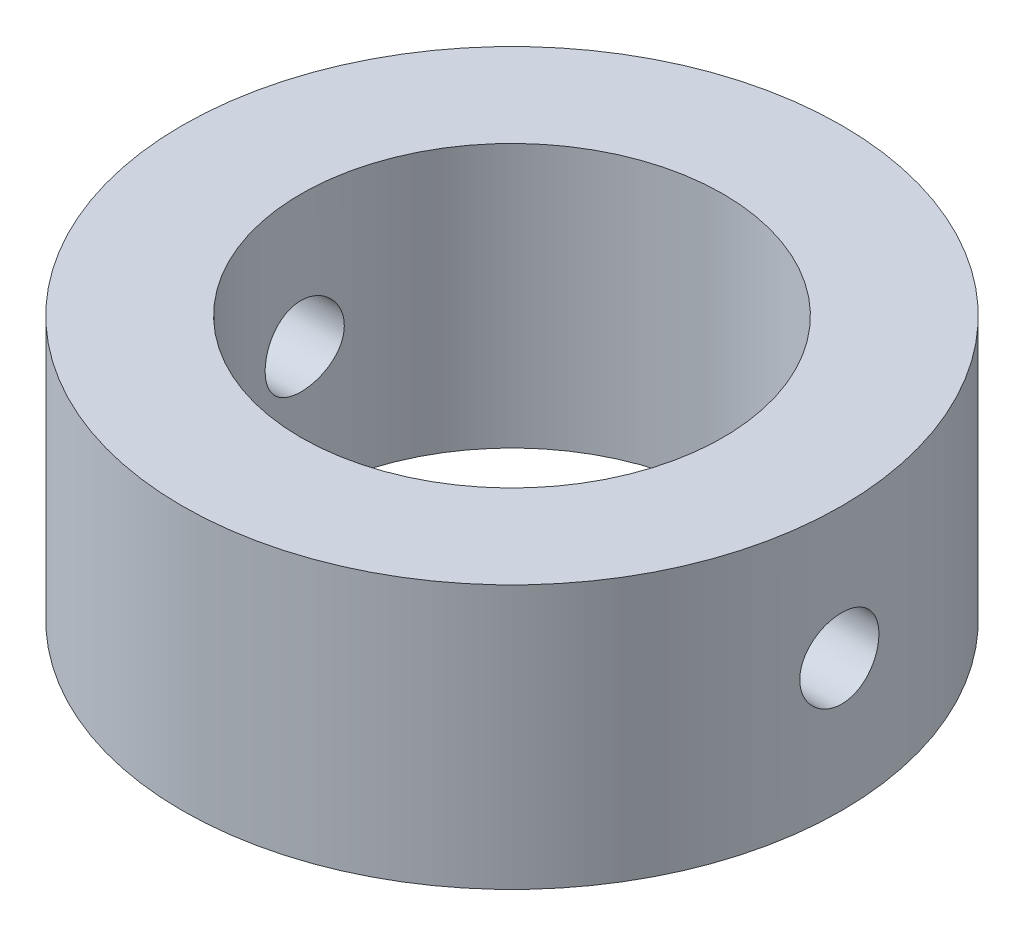
ISO-10303-21;
HEADER;
FILE_DESCRIPTION(('STEP AP214'),'2;1');
FILE_NAME('part.step','',(''),(''),'','','');
FILE_SCHEMA(('AUTOMOTIVE_DESIGN { 1 0 10303 214 1 1 1 1 }'));
ENDSEC;
DATA;
#1=APPLICATION_CONTEXT('core data for automotive mechanical design processes');
#2=APPLICATION_PROTOCOL_DEFINITION('international standard','automotive_design',2000,#1);
#3=PRODUCT_CONTEXT('',#1,'mechanical');
#4=PRODUCT('Part','Part','',(#3));
#5=PRODUCT_RELATED_PRODUCT_CATEGORY('part','',(#4));
#6=PRODUCT_DEFINITION_FORMATION('','',#4);
#7=PRODUCT_DEFINITION_CONTEXT('part definition',#1,'design');
#8=PRODUCT_DEFINITION('design','',#6,#7);
#9=PRODUCT_DEFINITION_SHAPE('','',#8);
#10=(LENGTH_UNIT() NAMED_UNIT(*) SI_UNIT(.MILLI.,.METRE.));
#11=(NAMED_UNIT(*) PLANE_ANGLE_UNIT() SI_UNIT($,.RADIAN.));
#12=(NAMED_UNIT(*) SI_UNIT($,.STERADIAN.) SOLID_ANGLE_UNIT());
#13=UNCERTAINTY_MEASURE_WITH_UNIT(LENGTH_MEASURE(1.E-05),#10,'distance_accuracy_value','');
#14=(GEOMETRIC_REPRESENTATION_CONTEXT(3) GLOBAL_UNCERTAINTY_ASSIGNED_CONTEXT((#13)) GLOBAL_UNIT_ASSIGNED_CONTEXT((#10,
#11,#12)) REPRESENTATION_CONTEXT('',''));
#15=CARTESIAN_POINT('',(0.,0.,0.));
#16=DIRECTION('',(0.,0.,1.));
#17=DIRECTION('',(1.,0.,0.));
#18=AXIS2_PLACEMENT_3D('',#15,#16,#17);
#19=CARTESIAN_POINT('',(6.59950128580252E-06,7.50000100534023,-6.87768785484062E-07));
#20=DIRECTION('',(0.,1.,0.));
#21=DIRECTION('',(0.,0.,1.));
#22=AXIS2_PLACEMENT_3D('',#19,#20,#21);
#23=PLANE('',#22);
#24=CARTESIAN_POINT('',(6.59950128580252E-06,7.50000100534023,-6.87768785484062E-07));
#25=DIRECTION('',(0.,1.,0.));
#26=DIRECTION('',(0.,0.,1.));
#27=AXIS2_PLACEMENT_3D('',#24,#25,#26);
#28=CIRCLE('',#27,6.25);
#29=CARTESIAN_POINT('',(6.59950128580252E-06,7.50000100534023,6.24999931223121));
#30=VERTEX_POINT('',#29);
#31=EDGE_CURVE('E10',#30,#30,#28,.T.);
#32=ORIENTED_EDGE('',*,*,#31,.T.);
#33=EDGE_LOOP('',(#32));
#34=FACE_BOUND('',#33,.T.);
#35=CARTESIAN_POINT('',(6.59950128580252E-06,7.50000100534023,-6.87768785484062E-07));
#36=DIRECTION('',(0.,1.,0.));
#37=DIRECTION('',(0.,0.,1.));
#38=AXIS2_PLACEMENT_3D('',#35,#36,#37);
#39=CIRCLE('',#38,4.);
#40=CARTESIAN_POINT('',(6.59950128580252E-06,7.50000100534023,3.99999931223121));
#41=VERTEX_POINT('',#40);
#42=EDGE_CURVE('E57',#41,#41,#39,.T.);
#43=ORIENTED_EDGE('',*,*,#42,.F.);
#44=EDGE_LOOP('',(#43));
#45=FACE_BOUND('',#44,.T.);
#46=ADVANCED_FACE('F36',(#34,#45),#23,.T.);
#47=CARTESIAN_POINT('',(6.59950128580252E-06,2.50000100534023,-6.87768785484062E-07));
#48=DIRECTION('',(0.,1.,0.));
#49=DIRECTION('',(0.,0.,1.));
#50=AXIS2_PLACEMENT_3D('',#47,#48,#49);
#51=PLANE('',#50);
#52=CARTESIAN_POINT('',(6.59950128580252E-06,2.50000100534023,-6.87768785484062E-07));
#53=DIRECTION('',(0.,1.,0.));
#54=DIRECTION('',(0.,0.,1.));
#55=AXIS2_PLACEMENT_3D('',#52,#53,#54);
#56=CIRCLE('',#55,6.25);
#57=CARTESIAN_POINT('',(6.59950128580252E-06,2.50000100534023,6.24999931223121));
#58=VERTEX_POINT('',#57);
#59=EDGE_CURVE('E51',#58,#58,#56,.T.);
#60=ORIENTED_EDGE('',*,*,#59,.F.);
#61=EDGE_LOOP('',(#60));
#62=FACE_BOUND('',#61,.T.);
#63=CARTESIAN_POINT('',(6.59950128580252E-06,2.50000100534023,-6.87768785484062E-07));
#64=DIRECTION('',(0.,1.,0.));
#65=DIRECTION('',(0.,0.,1.));
#66=AXIS2_PLACEMENT_3D('',#63,#64,#65);
#67=CIRCLE('',#66,4.);
#68=CARTESIAN_POINT('',(6.59950128580252E-06,2.50000100534023,3.99999931223121));
#69=VERTEX_POINT('',#68);
#70=EDGE_CURVE('E60',#69,#69,#67,.T.);
#71=ORIENTED_EDGE('',*,*,#70,.T.);
#72=EDGE_LOOP('',(#71));
#73=FACE_BOUND('',#72,.T.);
#74=ADVANCED_FACE('F101',(#62,#73),#51,.F.);
#75=CARTESIAN_POINT('',(6.59950128580252E-06,7.50000100534023,-6.87768785484062E-07));
#76=DIRECTION('',(0.,-1.,0.));
#77=DIRECTION('',(0.,0.,-1.));
#78=AXIS2_PLACEMENT_3D('',#75,#76,#77);
#79=CYLINDRICAL_SURFACE('',#78,6.25);
#80=CARTESIAN_POINT('',(6.25000659950128,4.25000100534023,-6.87768785484062E-07));
#81=CARTESIAN_POINT('',(6.25000603343776,4.25000279632559,0.0419653240081394));
#82=CARTESIAN_POINT('',(6.24957945451149,4.2535351700134,0.0839578915640124));
#83=CARTESIAN_POINT('',(6.24791877585678,4.26757127137908,0.166775455058277));
#84=CARTESIAN_POINT('',(6.24668382284448,4.27808236565288,0.207599169628732));
#85=CARTESIAN_POINT('',(6.24354558113694,4.30576257447173,0.286868011066347));
#86=CARTESIAN_POINT('',(6.241642732384,4.32292730704627,0.325314684129276));
#87=CARTESIAN_POINT('',(6.23738058110991,4.36341818911105,0.398774101689215));
#88=CARTESIAN_POINT('',(6.23502135960481,4.38674324527856,0.433787454015004));
#89=CARTESIAN_POINT('',(6.23009662586177,4.43901972083404,0.499572141067342));
#90=CARTESIAN_POINT('',(6.22753022527389,4.46799621536821,0.530323485058015));
#91=CARTESIAN_POINT('',(6.22248758443008,4.5306992465622,0.586539139827069));
#92=CARTESIAN_POINT('',(6.22001134867798,4.56442602009489,0.612003186797398));
#93=CARTESIAN_POINT('',(6.2154206087614,4.63580121166483,0.656995169415955));
#94=CARTESIAN_POINT('',(6.21330724710056,4.67346143648526,0.676504501412639));
#95=CARTESIAN_POINT('',(6.20969313311843,4.75155318086742,0.708914455485114));
#96=CARTESIAN_POINT('',(6.20819235934623,4.79198460333256,0.721815308973155));
#97=CARTESIAN_POINT('',(6.20598175134472,4.87426422016809,0.740581637344713));
#98=CARTESIAN_POINT('',(6.20526813581485,4.91610463744715,0.74648075720033));
#99=CARTESIAN_POINT('',(6.20470104176657,5.00018723943127,0.751180250280389));
#100=CARTESIAN_POINT('',(6.2048475312771,5.04242940914447,0.749980887363334));
#101=CARTESIAN_POINT('',(6.20598063615894,5.12588249653632,0.740545102427885));
#102=CARTESIAN_POINT('',(6.20696283536817,5.16709766501027,0.732345670286971));
#103=CARTESIAN_POINT('',(6.20964980169147,5.24756276229557,0.709200177656382));
#104=CARTESIAN_POINT('',(6.21135458239347,5.28681265413498,0.694253990295751));
#105=CARTESIAN_POINT('',(6.21529965148819,5.36234837240001,0.657999263980869));
#106=CARTESIAN_POINT('',(6.21754129605623,5.39862637492862,0.636674577741027));
#107=CARTESIAN_POINT('',(6.2223064491988,5.46710280806917,0.588279745154888));
#108=CARTESIAN_POINT('',(6.2248299696566,5.49930106656587,0.561209356539106));
#109=CARTESIAN_POINT('',(6.22989418221721,5.55891877643132,0.501886201136664));
#110=CARTESIAN_POINT('',(6.23243488135728,5.58630649780449,0.469601537359254));
#111=CARTESIAN_POINT('',(6.23723211946501,5.63527888559031,0.400876301965895));
#112=CARTESIAN_POINT('',(6.2394886578618,5.65686354034502,0.364435722001226));
#113=CARTESIAN_POINT('',(6.24346457104383,5.69361682675014,0.288409139296926));
#114=CARTESIAN_POINT('',(6.24518378632152,5.70878355367284,0.248822206910112));
#115=CARTESIAN_POINT('',(6.24788986582854,5.73224568980296,0.167638317799574));
#116=CARTESIAN_POINT('',(6.24887676164089,5.74054139534135,0.12604144784162));
#117=CARTESIAN_POINT('',(6.25000291200888,5.74998506921465,0.0422929113247686));
#118=CARTESIAN_POINT('',(6.2501473518451,5.7511767634404,0.000146242339227246));
#119=CARTESIAN_POINT('',(6.24958629508206,5.74649386087316,-0.0837462048296007));
#120=CARTESIAN_POINT('',(6.24888081513397,5.74061940251639,-0.125491990850618));
#121=CARTESIAN_POINT('',(6.24670243401844,5.72200726433946,-0.207269253750875));
#122=CARTESIAN_POINT('',(6.245231855449,5.70929035207771,-0.247305524361044));
#123=CARTESIAN_POINT('',(6.2416879870461,5.67737582950183,-0.3246770371904));
#124=CARTESIAN_POINT('',(6.23961467822025,5.65817801496771,-0.362012194249654));
#125=CARTESIAN_POINT('',(6.23508372846865,5.61374027636462,-0.433117482185047));
#126=CARTESIAN_POINT('',(6.23262430161736,5.58847197088753,-0.466869760175663));
#127=CARTESIAN_POINT('',(6.22760204748677,5.53265079373819,-0.529669750649294));
#128=CARTESIAN_POINT('',(6.22503921643839,5.50209772930324,-0.558717291451159));
#129=CARTESIAN_POINT('',(6.22008308662484,5.43638210148331,-0.61143767583417));
#130=CARTESIAN_POINT('',(6.21769074528397,5.40119625150427,-0.635081595848633));
#131=CARTESIAN_POINT('',(6.21336197433587,5.32732724907134,-0.676123973842115));
#132=CARTESIAN_POINT('',(6.21142553619985,5.28864416206067,-0.69352254865897));
#133=CARTESIAN_POINT('',(6.20823424286384,5.20897335311656,-0.721533179439182));
#134=CARTESIAN_POINT('',(6.20697773139211,5.16799150237538,-0.73216173816715));
#135=CARTESIAN_POINT('',(6.20528373136596,5.08480876296896,-0.746383868177577));
#136=CARTESIAN_POINT('',(6.20484620792894,5.0426079263009,-0.749977739083989));
#137=CARTESIAN_POINT('',(6.20484068115302,4.95847282293094,-0.750023272313612));
#138=CARTESIAN_POINT('',(6.20526714609987,4.91653857389741,-0.746520371947162));
#139=CARTESIAN_POINT('',(6.20692967318692,4.83385930874169,-0.732567809449008));
#140=CARTESIAN_POINT('',(6.2081657356177,4.79311429304633,-0.722118144823953));
#141=CARTESIAN_POINT('',(6.21130651261594,4.71397487061806,-0.694582537320149));
#142=CARTESIAN_POINT('',(6.21321102492159,4.67557975696636,-0.677498601695133));
#143=CARTESIAN_POINT('',(6.21747446297975,4.6021940685727,-0.637183894338809));
#144=CARTESIAN_POINT('',(6.21983339265511,4.5672035232254,-0.613953069542399));
#145=CARTESIAN_POINT('',(6.22475797756597,4.50138777031302,-0.561834911886798));
#146=CARTESIAN_POINT('',(6.22732481403496,4.47058947952366,-0.532913697594161));
#147=CARTESIAN_POINT('',(6.23236547370551,4.41426538544873,-0.470305921104903));
#148=CARTESIAN_POINT('',(6.23483927476403,4.38874083093293,-0.436618233427788));
#149=CARTESIAN_POINT('',(6.23942464223439,4.34361336084052,-0.365298993931628));
#150=CARTESIAN_POINT('',(6.24153490490653,4.32403157390966,-0.32765399642483));
#151=CARTESIAN_POINT('',(6.24514206249445,4.29149506422959,-0.249606375690114));
#152=CARTESIAN_POINT('',(6.24663962901666,4.27853308129513,-0.209206828859322));
#153=CARTESIAN_POINT('',(6.24848830765126,4.2627351502557,-0.140494963077959));
#154=CARTESIAN_POINT('',(6.24905491935952,4.25796663436864,-0.112617330207157));
#155=CARTESIAN_POINT('',(6.24981425460638,4.25159896946749,-0.0564973716922087));
#156=CARTESIAN_POINT('',(6.25000698061358,4.24999979952762,-0.0282550484571916));
#157=CARTESIAN_POINT('',(6.25000659950128,4.25000100534023,-6.87768785484062E-07));
#158=B_SPLINE_CURVE_WITH_KNOTS('',3,(#80,#81,#82,#83,#84,#85,#86,#87,#88,#89,#90,#91,#92,#93,
#94,#95,#96,#97,#98,#99,#100,#101,#102,#103,#104,#105,#106,#107,#108,#109,#110,#111,#112,#113,
#114,#115,#116,#117,#118,#119,#120,#121,#122,#123,#124,#125,#126,#127,#128,#129,#130,#131,#132,
#133,#134,#135,#136,#137,#138,#139,#140,#141,#142,#143,#144,#145,#146,#147,#148,#149,#150,#151,
#152,#153,#154,#155,#156,#157),.UNSPECIFIED.,.T.,.F.,(4,2,2,2,2,2,2,2,2,2,2,2,2,2,2,2,2,2,2,2,2,
2,2,2,2,2,2,2,2,2,2,2,2,2,2,2,2,2,4),(0.,0.12579483773904,0.251722673521558,0.3775677159389,
0.503390438604232,0.629784680489694,0.756185227262208,0.882976723740993,1.00976377999778,
1.1359390958582,1.2621097216712,1.38761773228063,1.51312810313349,1.63895893427634,
1.76479507217315,1.89143236160079,2.0180699054315,2.1447450067357,2.27141464455655,
2.39730380656057,2.5231905022527,2.64869725639437,2.77420796575417,2.90031730446391,
3.02643124400891,3.15320518954179,3.27997676326575,3.40643812066222,3.53289409165386,
3.65854298298073,3.78419191940584,3.90980286928471,4.03541490357804,4.1617988100508,
4.28821260880023,4.41507072559865,4.54178941198187,4.62648357364067,4.71117717609952),.UNSPECIFIED.);
#159=CARTESIAN_POINT('',(6.25000659950128,4.25000100534023,-6.87768785484062E-07));
#160=VERTEX_POINT('',#159);
#161=EDGE_CURVE('E87',#160,#160,#158,.T.);
#162=ORIENTED_EDGE('',*,*,#161,.T.);
#163=EDGE_LOOP('',(#162));
#164=FACE_BOUND('',#163,.T.);
#165=CARTESIAN_POINT('',(-6.20483022349414,5.00000100534023,0.749999312231215));
#166=CARTESIAN_POINT('',(-6.20483080495709,4.95803622004264,0.749997520163155));
#167=CARTESIAN_POINT('',(-6.2052605452094,4.91604487530988,0.746465345972059));
#168=CARTESIAN_POINT('',(-6.20693251325954,4.83322985233234,0.732430109005308));
#169=CARTESIAN_POINT('',(-6.20817560014788,4.79240745641997,0.721919675328756));
#170=CARTESIAN_POINT('',(-6.21133147812968,4.71314140396178,0.694241398770804));
#171=CARTESIAN_POINT('',(-6.21324382518271,4.67469619005617,0.677077969205585));
#172=CARTESIAN_POINT('',(-6.21752221299091,4.60123921981499,0.63659015612607));
#173=CARTESIAN_POINT('',(-6.21988817344701,4.56622685744824,0.613266862761251));
#174=CARTESIAN_POINT('',(-6.22482090186491,4.50044106243769,0.560992172056312));
#175=CARTESIAN_POINT('',(-6.22738854591141,4.46968793175308,0.532015305357831));
#176=CARTESIAN_POINT('',(-6.23242744013515,4.41346882579975,0.469310778318412));
#177=CARTESIAN_POINT('',(-6.23489868559792,4.38800310885478,0.435582885994748));
#178=CARTESIAN_POINT('',(-6.23947525107525,4.34300937210616,0.364206704348208));
#179=CARTESIAN_POINT('',(-6.24157943501535,4.32349965140532,0.326546800693462));
#180=CARTESIAN_POINT('',(-6.24517518157975,4.29108889024404,0.248455754049409));
#181=CARTESIAN_POINT('',(-6.24666676523539,4.2781876229033,0.2080247062526));
#182=CARTESIAN_POINT('',(-6.24886308361185,4.25942044131437,0.125746276477485));
#183=CARTESIAN_POINT('',(-6.24957158460891,4.25352084197879,0.0839066799920591));
#184=CARTESIAN_POINT('',(-6.25013475965125,4.2488201055126,-0.000174311935926913));
#185=CARTESIAN_POINT('',(-6.24998946479958,4.25001870980067,-0.0424156926858705));
#186=CARTESIAN_POINT('',(-6.24886447363037,4.25945328580307,-0.125872104648168));
#187=CARTESIAN_POINT('',(-6.24788907260716,4.26765303158333,-0.167091297160839));
#188=CARTESIAN_POINT('',(-6.24521831105823,4.29080054326923,-0.24756428029158));
#189=CARTESIAN_POINT('',(-6.24352293776036,4.30574842888564,-0.286818036029437));
#190=CARTESIAN_POINT('',(-6.23959534811255,4.34200668756686,-0.36235846858363));
#191=CARTESIAN_POINT('',(-6.23736180521601,4.36333281434184,-0.398637512087632));
#192=CARTESIAN_POINT('',(-6.23260792467774,4.41173073007927,-0.467115417818482));
#193=CARTESIAN_POINT('',(-6.23008757491361,4.43880276194413,-0.499314107460508));
#194=CARTESIAN_POINT('',(-6.22502356913111,4.49812709272534,-0.558929990576409));
#195=CARTESIAN_POINT('',(-6.22247986631227,4.53041095068361,-0.586315784964733));
#196=CARTESIAN_POINT('',(-6.21767155165058,4.59913388376011,-0.635284667331678));
#197=CARTESIAN_POINT('',(-6.21540694056359,4.63557297013135,-0.6568677395951));
#198=CARTESIAN_POINT('',(-6.2114132018791,4.71159912787707,-0.693619883665409));
#199=CARTESIAN_POINT('',(-6.20968427386288,4.75118736565471,-0.708786565662889));
#200=CARTESIAN_POINT('',(-6.206961608164,4.83237409521552,-0.732248212849729));
#201=CARTESIAN_POINT('',(-6.205967837917,4.87397249787005,-0.740543482415163));
#202=CARTESIAN_POINT('',(-6.20483390088963,4.9577217794344,-0.749985509549199));
#203=CARTESIAN_POINT('',(-6.20468846451456,4.99986761431051,-0.751176398445716));
#204=CARTESIAN_POINT('',(-6.20525373302736,5.08375820055096,-0.746492182907792));
#205=CARTESIAN_POINT('',(-6.20596442113122,5.12550295976207,-0.740617216996906));
#206=CARTESIAN_POINT('',(-6.20815705737318,5.20727495123972,-0.72200516762383));
#207=CARTESIAN_POINT('',(-6.20963661555267,5.24730709204256,-0.70928934401613));
#208=CARTESIAN_POINT('',(-6.21319834682992,5.32467082608422,-0.677378379750345));
#209=CARTESIAN_POINT('',(-6.21528053952156,5.36200233146599,-0.658183028415315));
#210=CARTESIAN_POINT('',(-6.21982558333119,5.43310507908388,-0.613748944572812));
#211=CARTESIAN_POINT('',(-6.2222902407451,5.46685807706056,-0.588481205622475));
#212=CARTESIAN_POINT('',(-6.22731678900794,5.52965978359318,-0.532660732360553));
#213=CARTESIAN_POINT('',(-6.22987868333467,5.5587083236917,-0.502107808877836));
#214=CARTESIAN_POINT('',(-6.23482717412147,5.61143094214896,-0.436391755935716));
#215=CARTESIAN_POINT('',(-6.23721278189948,5.63507606696809,-0.401205312623244));
#216=CARTESIAN_POINT('',(-6.24152521127772,5.6761205576725,-0.32733479512143));
#217=CARTESIAN_POINT('',(-6.24345204149965,5.69352004093384,-0.288650786679889));
#218=CARTESIAN_POINT('',(-6.24662541126157,5.72153125655918,-0.208980498948782));
#219=CARTESIAN_POINT('',(-6.24787364306442,5.73215988531129,-0.168000230430581));
#220=CARTESIAN_POINT('',(-6.24955618461139,5.74638269123577,-0.0848208340166548));
#221=CARTESIAN_POINT('',(-6.24999052803786,5.74997715951351,-0.0426217566341006));
#222=CARTESIAN_POINT('',(-6.24999622671489,5.75002446636831,0.0415143137951297));
#223=CARTESIAN_POINT('',(-6.24957298462993,5.74652201451103,0.0834512883959331));
#224=CARTESIAN_POINT('',(-6.24792178555049,5.73256939161461,0.166136118430274));
#225=CARTESIAN_POINT('',(-6.24669382881978,5.72211922285285,0.206883974253587));
#226=CARTESIAN_POINT('',(-6.24357060098595,5.69458150155733,0.286029201227119));
#227=CARTESIAN_POINT('',(-6.24167552747745,5.67749591422661,0.324427264418214));
#228=CARTESIAN_POINT('',(-6.23742821157774,5.63717698794413,0.397818164862543));
#229=CARTESIAN_POINT('',(-6.23507596548675,5.61394359923951,0.43281097455464));
#230=CARTESIAN_POINT('',(-6.2301593845553,5.56182258483866,0.49862668329336));
#231=CARTESIAN_POINT('',(-6.227593854901,5.53290166650879,0.529423129200414));
#232=CARTESIAN_POINT('',(-6.22254957211348,5.47029524605212,0.585743639012236));
#233=CARTESIAN_POINT('',(-6.22007083972982,5.4366086142149,0.611266449263931));
#234=CARTESIAN_POINT('',(-6.21547138068691,5.36529027129761,0.656391999053079));
#235=CARTESIAN_POINT('',(-6.21335196190894,5.32764492327199,0.675973307731988));
#236=CARTESIAN_POINT('',(-6.20972645991721,5.24959656690254,0.708508826790574));
#237=CARTESIAN_POINT('',(-6.20821970459777,5.20919663754079,0.72147030329629));
#238=CARTESIAN_POINT('',(-6.20635908142341,5.14048612056388,0.737266837415317));
#239=CARTESIAN_POINT('',(-6.20578858324748,5.11261031735026,0.742034724586083));
#240=CARTESIAN_POINT('',(-6.20502395982509,5.05649402230667,0.748401554504992));
#241=CARTESIAN_POINT('',(-6.20482983202787,5.02825353294958,0.750000518729758));
#242=CARTESIAN_POINT('',(-6.20483022349414,5.00000100534023,0.749999312231215));
#243=B_SPLINE_CURVE_WITH_KNOTS('',3,(#165,#166,#167,#168,#169,#170,#171,#172,#173,#174,#175,
#176,#177,#178,#179,#180,#181,#182,#183,#184,#185,#186,#187,#188,#189,#190,#191,#192,#193,#194,
#195,#196,#197,#198,#199,#200,#201,#202,#203,#204,#205,#206,#207,#208,#209,#210,#211,#212,#213,
#214,#215,#216,#217,#218,#219,#220,#221,#222,#223,#224,#225,#226,#227,#228,#229,#230,#231,#232,
#233,#234,#235,#236,#237,#238,#239,#240,#241,#242),.UNSPECIFIED.,.T.,.F.,(4,2,2,2,2,2,2,2,2,2,2,
2,2,2,2,2,2,2,2,2,2,2,2,2,2,2,2,2,2,2,2,2,2,2,2,2,2,2,4),(0.,0.125791153304806,
0.251715387409657,0.377556231261131,0.503374819180551,0.629773883301885,0.756179121368053,
0.882968904383848,1.00975433418224,1.13592729304026,1.26209565555656,1.38761511539672,
1.51313680201668,1.63897111338818,1.76481074533959,1.89144311102211,2.0180758196528,
2.14475565169147,2.27142987202041,2.39731638521574,2.52320043049125,2.64869549741552,
2.77419464511013,2.90030562577654,3.02642112123234,3.15319732323819,3.27997114257959,
3.40642735085244,3.53287832568464,3.65853515469538,3.78419194251719,3.90981154308249,
4.03543216029188,4.16181126030953,4.28822036879556,4.41508015540411,4.54180039602981,
4.62648907232436,4.71117717465954),.UNSPECIFIED.);
#244=CARTESIAN_POINT('',(-6.20483022349414,5.00000100534023,0.749999312231215));
#245=VERTEX_POINT('',#244);
#246=EDGE_CURVE('E81',#245,#245,#243,.T.);
#247=ORIENTED_EDGE('',*,*,#246,.T.);
#248=EDGE_LOOP('',(#247));
#249=FACE_BOUND('',#248,.T.);
#250=ORIENTED_EDGE('',*,*,#31,.F.);
#251=EDGE_LOOP('',(#250));
#252=FACE_BOUND('',#251,.T.);
#253=ORIENTED_EDGE('',*,*,#59,.T.);
#254=EDGE_LOOP('',(#253));
#255=FACE_BOUND('',#254,.T.);
#256=ADVANCED_FACE('F38',(#164,#249,#252,#255),#79,.T.);
#257=CARTESIAN_POINT('',(6.59950128580252E-06,7.50000100534023,-6.87768785484062E-07));
#258=DIRECTION('',(0.,-1.,0.));
#259=DIRECTION('',(0.,0.,-1.));
#260=AXIS2_PLACEMENT_3D('',#257,#258,#259);
#261=CYLINDRICAL_SURFACE('',#260,4.);
#262=CARTESIAN_POINT('',(3.92906501087671,5.00000100534023,0.749999312231215));
#263=CARTESIAN_POINT('',(3.92906581859662,5.0417296093405,0.749997711648171));
#264=CARTESIAN_POINT('',(3.92973699885562,5.08347897943181,0.74650494397952));
#265=CARTESIAN_POINT('',(3.93234585513826,5.16580048611472,0.732635578493728));
#266=CARTESIAN_POINT('',(3.93428460551877,5.20637159355069,0.722253141074014));
#267=CARTESIAN_POINT('',(3.93920148167455,5.28513354103146,0.694934490318863));
#268=CARTESIAN_POINT('',(3.94217863899075,5.32332655999543,0.678004382002739));
#269=CARTESIAN_POINT('',(3.9488357311466,5.39632778498208,0.638087141033389));
#270=CARTESIAN_POINT('',(3.95251561114031,5.43113625484146,0.615100481027274));
#271=CARTESIAN_POINT('',(3.96021467368497,5.49681610494022,0.563417706944232));
#272=CARTESIAN_POINT('',(3.96423718262672,5.52763924707621,0.534660776896647));
#273=CARTESIAN_POINT('',(3.97213888782441,5.5840532001399,0.472385201633015));
#274=CARTESIAN_POINT('',(3.97601807465784,5.6096436675526,0.438866244043693));
#275=CARTESIAN_POINT('',(3.98323168864251,5.65505069364052,0.367701259516288));
#276=CARTESIAN_POINT('',(3.98656173976289,5.67482177209995,0.330025732248145));
#277=CARTESIAN_POINT('',(3.99226464266615,5.70773577647699,0.251814953856597));
#278=CARTESIAN_POINT('',(3.99463757314301,5.72087924733534,0.211279938160967));
#279=CARTESIAN_POINT('',(3.99813537512012,5.7400157796458,0.129000685324922));
#280=CARTESIAN_POINT('',(3.99927442938291,5.74609015830157,0.0872759738536425));
#281=CARTESIAN_POINT('',(4.00022502257927,5.75116944919043,0.00338515024890577));
#282=CARTESIAN_POINT('',(4.00003667455477,5.75017496340976,-0.038780923992621));
#283=CARTESIAN_POINT('',(3.99836476831749,5.74120711976665,-0.121799866718484));
#284=CARTESIAN_POINT('',(3.99689746073735,5.73332132062522,-0.162662567994521));
#285=CARTESIAN_POINT('',(3.99285073116909,5.71093318064261,-0.242474270626524));
#286=CARTESIAN_POINT('',(3.99027126865111,5.69643059866733,-0.281423202182056));
#287=CARTESIAN_POINT('',(3.98426290098798,5.66113713981108,-0.356555720644546));
#288=CARTESIAN_POINT('',(3.98082928745541,5.64031126138398,-0.392722473688052));
#289=CARTESIAN_POINT('',(3.97349233721553,5.59298817080165,-0.461080676376105));
#290=CARTESIAN_POINT('',(3.96958895275711,5.56649038189644,-0.493271721224178));
#291=CARTESIAN_POINT('',(3.96167416790412,5.50809315384846,-0.553283497253305));
#292=CARTESIAN_POINT('',(3.95766202900939,5.47611711338919,-0.581029641553992));
#293=CARTESIAN_POINT('',(3.95003914412439,5.40792623970092,-0.630776547025088));
#294=CARTESIAN_POINT('',(3.94642840400804,5.37171134445791,-0.652777224124696));
#295=CARTESIAN_POINT('',(3.94001606603689,5.2959718699889,-0.690429948891174));
#296=CARTESIAN_POINT('',(3.93721585215259,5.25644177674491,-0.706071155995892));
#297=CARTESIAN_POINT('',(3.93276281148473,5.17525041327863,-0.730468972644066));
#298=CARTESIAN_POINT('',(3.93110985469438,5.13358938510784,-0.739226362274326));
#299=CARTESIAN_POINT('',(3.92916420100631,5.04999134091229,-0.749499051017481));
#300=CARTESIAN_POINT('',(3.92885137858197,5.00806794755747,-0.751121509198079));
#301=CARTESIAN_POINT('',(3.92956755660549,4.92454927779665,-0.747365532177408));
#302=CARTESIAN_POINT('',(3.93059649069434,4.88295398526619,-0.741987443200951));
#303=CARTESIAN_POINT('',(3.93386149981731,4.80162455381304,-0.724475028748198));
#304=CARTESIAN_POINT('',(3.93608753295568,4.76187787902778,-0.712396880688733));
#305=CARTESIAN_POINT('',(3.94148727028438,4.68497241047515,-0.681886809664085));
#306=CARTESIAN_POINT('',(3.94466104431769,4.64781380768256,-0.66345441841276));
#307=CARTESIAN_POINT('',(3.95164448881971,4.57666719581864,-0.620512453367086));
#308=CARTESIAN_POINT('',(3.95546107662786,4.54272073640719,-0.595935185966891));
#309=CARTESIAN_POINT('',(3.96328065634179,4.47939498523306,-0.541492409490019));
#310=CARTESIAN_POINT('',(3.96728366498375,4.45001610456234,-0.511626424934204));
#311=CARTESIAN_POINT('',(3.97508971953101,4.39625912357317,-0.446975396703978));
#312=CARTESIAN_POINT('',(3.97888937866781,4.37195309203725,-0.412129954816731));
#313=CARTESIAN_POINT('',(3.98580362355304,4.3295404022514,-0.338787949288855));
#314=CARTESIAN_POINT('',(3.98891823567491,4.31143350532773,-0.30029152628805));
#315=CARTESIAN_POINT('',(3.99409688948052,4.28204095640819,-0.220939458558128));
#316=CARTESIAN_POINT('',(3.996166373152,4.27071991155953,-0.180097294308279));
#317=CARTESIAN_POINT('',(3.99904480992001,4.25510748119529,-0.0970488014595709));
#318=CARTESIAN_POINT('',(3.99985389565095,4.25081535600888,-0.054842616876711));
#319=CARTESIAN_POINT('',(4.00011773707849,4.24940835458101,0.0290446923564692));
#320=CARTESIAN_POINT('',(3.99959303262645,4.25218462877547,0.0707239657643486));
#321=CARTESIAN_POINT('',(3.9972909325598,4.26459721922445,0.153010996870814));
#322=CARTESIAN_POINT('',(3.99551354895464,4.27423346971233,0.193618764838059));
#323=CARTESIAN_POINT('',(3.99090578939151,4.30004660903209,0.272552550028957));
#324=CARTESIAN_POINT('',(3.98807727940918,4.31621191178073,0.310882471890326));
#325=CARTESIAN_POINT('',(3.98167345984513,4.35461123216782,0.384302127889561));
#326=CARTESIAN_POINT('',(3.97809810023365,4.37684565639356,0.419391644732849));
#327=CARTESIAN_POINT('',(3.97053049880105,4.42712673256139,0.485876826121218));
#328=CARTESIAN_POINT('',(3.96653302245785,4.45525202227108,0.517212429926481));
#329=CARTESIAN_POINT('',(3.95860476719525,4.51635328658659,0.57475699255864));
#330=CARTESIAN_POINT('',(3.95467400418434,4.54933040052711,0.600964743855111));
#331=CARTESIAN_POINT('',(3.94728448663169,4.61956423269189,0.647737481958143));
#332=CARTESIAN_POINT('',(3.94383043590783,4.65685772517399,0.66824801489059));
#333=CARTESIAN_POINT('',(3.93784202274856,4.73441390033016,0.702679974348281));
#334=CARTESIAN_POINT('',(3.93530679273607,4.77467373863515,0.716607620425714));
#335=CARTESIAN_POINT('',(3.9319716809698,4.84587714937302,0.734647945212136));
#336=CARTESIAN_POINT('',(3.93088815311669,4.87640386722065,0.740394840930614));
#337=CARTESIAN_POINT('',(3.92943452745306,4.93795023955094,0.748071067612142));
#338=CARTESIAN_POINT('',(3.92906441022261,4.96896988059244,0.750000502491308));
#339=CARTESIAN_POINT('',(3.92906501087671,5.00000100534023,0.749999312231215));
#340=B_SPLINE_CURVE_WITH_KNOTS('',3,(#262,#263,#264,#265,#266,#267,#268,#269,#270,#271,#272,
#273,#274,#275,#276,#277,#278,#279,#280,#281,#282,#283,#284,#285,#286,#287,#288,#289,#290,#291,
#292,#293,#294,#295,#296,#297,#298,#299,#300,#301,#302,#303,#304,#305,#306,#307,#308,#309,#310,
#311,#312,#313,#314,#315,#316,#317,#318,#319,#320,#321,#322,#323,#324,#325,#326,#327,#328,#329,
#330,#331,#332,#333,#334,#335,#336,#337,#338,#339),.UNSPECIFIED.,.T.,.F.,(4,2,2,2,2,2,2,2,2,2,2,
2,2,2,2,2,2,2,2,2,2,2,2,2,2,2,2,2,2,2,2,2,2,2,2,2,2,2,4),(0.,0.125072252888068,
0.250250651173654,0.375312613972673,0.500364819952997,0.626811678476912,0.753266835330031,
0.880685521723694,1.00809372968166,1.13402137728476,1.2599383009867,1.38427825297708,
1.50862273662558,1.63366845990455,1.75872690454238,1.88570307380378,2.01268110094546,
2.13987468057479,2.26705384431589,2.39231624291883,2.51757244667705,2.6417939615603,
2.76602463310504,2.89168931325417,3.01736529695684,3.14472062746281,3.27207105409198,
3.39875134707687,3.52541830832011,3.65014650283415,3.77487350159429,3.89938013263524,
4.02389510676901,4.15019232002718,4.27651923863728,4.40401500907405,4.53139007872905,
4.62440153761953,4.71741046458558),.UNSPECIFIED.);
#341=CARTESIAN_POINT('',(3.92906501087671,5.00000100534023,0.749999312231215));
#342=VERTEX_POINT('',#341);
#343=EDGE_CURVE('E41',#342,#342,#340,.T.);
#344=ORIENTED_EDGE('',*,*,#343,.F.);
#345=EDGE_LOOP('',(#344));
#346=FACE_BOUND('',#345,.T.);
#347=CARTESIAN_POINT('',(-3.92905181187414,5.00000100534023,0.749999312231215));
#348=CARTESIAN_POINT('',(-3.92905261959405,4.95827240133996,0.749997711648171));
#349=CARTESIAN_POINT('',(-3.92972379985305,4.91652303124865,0.74650494397952));
#350=CARTESIAN_POINT('',(-3.93233265613569,4.83420152456574,0.732635578493728));
#351=CARTESIAN_POINT('',(-3.9342714065162,4.79363041712977,0.722253141074014));
#352=CARTESIAN_POINT('',(-3.93918828267197,4.714868469649,0.694934490318863));
#353=CARTESIAN_POINT('',(-3.94216543998818,4.67667545068503,0.678004382002738));
#354=CARTESIAN_POINT('',(-3.94882253214402,4.60367422569838,0.638087141033389));
#355=CARTESIAN_POINT('',(-3.95250241213773,4.568865755839,0.615100481027273));
#356=CARTESIAN_POINT('',(-3.9602014746824,4.50318590574024,0.563417706944232));
#357=CARTESIAN_POINT('',(-3.96422398362415,4.47236276360425,0.534660776896648));
#358=CARTESIAN_POINT('',(-3.97212568882184,4.41594881054056,0.472385201633015));
#359=CARTESIAN_POINT('',(-3.97600487565527,4.39035834312786,0.438866244043693));
#360=CARTESIAN_POINT('',(-3.98321848963994,4.34495131703994,0.367701259516288));
#361=CARTESIAN_POINT('',(-3.98654854076031,4.32518023858051,0.330025732248145));
#362=CARTESIAN_POINT('',(-3.99225144366358,4.29226623420347,0.251814953856597));
#363=CARTESIAN_POINT('',(-3.99462437414044,4.27912276334512,0.211279938160967));
#364=CARTESIAN_POINT('',(-3.99812217611755,4.25998623103466,0.129000685324922));
#365=CARTESIAN_POINT('',(-3.99926123038033,4.25391185237889,0.0872759738536424));
#366=CARTESIAN_POINT('',(-4.0002118235767,4.24883256149003,0.00338515024890565));
#367=CARTESIAN_POINT('',(-4.0000234755522,4.2498270472707,-0.0387809239926211));
#368=CARTESIAN_POINT('',(-3.99835156931492,4.2587948909138,-0.121799866718484));
#369=CARTESIAN_POINT('',(-3.99688426173478,4.26668069005524,-0.162662567994521));
#370=CARTESIAN_POINT('',(-3.99283753216652,4.28906883003785,-0.242474270626524));
#371=CARTESIAN_POINT('',(-3.99025806964854,4.30357141201313,-0.281423202182056));
#372=CARTESIAN_POINT('',(-3.98424970198541,4.33886487086938,-0.356555720644547));
#373=CARTESIAN_POINT('',(-3.98081608845284,4.35969074929648,-0.392722473688052));
#374=CARTESIAN_POINT('',(-3.97347913821296,4.40701383987881,-0.461080676376105));
#375=CARTESIAN_POINT('',(-3.96957575375453,4.43351162878402,-0.493271721224178));
#376=CARTESIAN_POINT('',(-3.96166096890155,4.491908856832,-0.553283497253305));
#377=CARTESIAN_POINT('',(-3.95764883000682,4.52388489729127,-0.581029641553992));
#378=CARTESIAN_POINT('',(-3.95002594512182,4.59207577097954,-0.630776547025088));
#379=CARTESIAN_POINT('',(-3.94641520500547,4.62829066622255,-0.652777224124696));
#380=CARTESIAN_POINT('',(-3.94000286703432,4.70403014069156,-0.690429948891174));
#381=CARTESIAN_POINT('',(-3.93720265315002,4.74356023393555,-0.706071155995892));
#382=CARTESIAN_POINT('',(-3.93274961248216,4.82475159740183,-0.730468972644066));
#383=CARTESIAN_POINT('',(-3.93109665569181,4.86641262557262,-0.739226362274326));
#384=CARTESIAN_POINT('',(-3.92915100200374,4.95001066976817,-0.749499051017481));
#385=CARTESIAN_POINT('',(-3.9288381795794,4.99193406312299,-0.751121509198079));
#386=CARTESIAN_POINT('',(-3.92955435760292,5.0754527328838,-0.747365532177408));
#387=CARTESIAN_POINT('',(-3.93058329169177,5.11704802541427,-0.741987443200951));
#388=CARTESIAN_POINT('',(-3.93384830081474,5.19837745686742,-0.724475028748198));
#389=CARTESIAN_POINT('',(-3.93607433395311,5.23812413165268,-0.712396880688733));
#390=CARTESIAN_POINT('',(-3.94147407128181,5.31502960020531,-0.681886809664085));
#391=CARTESIAN_POINT('',(-3.94464784531512,5.3521882029979,-0.66345441841276));
#392=CARTESIAN_POINT('',(-3.95163128981714,5.42333481486181,-0.620512453367085));
#393=CARTESIAN_POINT('',(-3.95544787762529,5.45728127427327,-0.59593518596689));
#394=CARTESIAN_POINT('',(-3.96326745733922,5.5206070254474,-0.541492409490018));
#395=CARTESIAN_POINT('',(-3.96727046598118,5.54998590611812,-0.511626424934203));
#396=CARTESIAN_POINT('',(-3.97507652052844,5.60374288710729,-0.446975396703978));
#397=CARTESIAN_POINT('',(-3.97887617966524,5.62804891864321,-0.41212995481673));
#398=CARTESIAN_POINT('',(-3.98579042455047,5.67046160842906,-0.338787949288855));
#399=CARTESIAN_POINT('',(-3.98890503667234,5.68856850535273,-0.300291526288049));
#400=CARTESIAN_POINT('',(-3.99408369047795,5.71796105427227,-0.220939458558127));
#401=CARTESIAN_POINT('',(-3.99615317414942,5.72928209912094,-0.180097294308279));
#402=CARTESIAN_POINT('',(-3.99903161091744,5.74489452948517,-0.0970488014595701));
#403=CARTESIAN_POINT('',(-3.99984069664838,5.74918665467159,-0.0548426168767104));
#404=CARTESIAN_POINT('',(-4.00010453807592,5.75059365609945,0.0290446923564698));
#405=CARTESIAN_POINT('',(-3.99957983362388,5.74781738190499,0.0707239657643494));
#406=CARTESIAN_POINT('',(-3.99727773355723,5.73540479145601,0.153010996870815));
#407=CARTESIAN_POINT('',(-3.99550034995207,5.72576854096812,0.19361876483806));
#408=CARTESIAN_POINT('',(-3.99089259038894,5.69995540164837,0.272552550028957));
#409=CARTESIAN_POINT('',(-3.98806408040661,5.68379009889973,0.310882471890327));
#410=CARTESIAN_POINT('',(-3.98166026084255,5.64539077851264,0.384302127889562));
#411=CARTESIAN_POINT('',(-3.97808490123108,5.6231563542869,0.41939164473285));
#412=CARTESIAN_POINT('',(-3.97051729979847,5.57287527811907,0.485876826121219));
#413=CARTESIAN_POINT('',(-3.96651982345528,5.54474998840938,0.517212429926482));
#414=CARTESIAN_POINT('',(-3.95859156819267,5.48364872409387,0.57475699255864));
#415=CARTESIAN_POINT('',(-3.95466080518177,5.45067161015335,0.600964743855112));
#416=CARTESIAN_POINT('',(-3.94727128762912,5.38043777798857,0.647737481958143));
#417=CARTESIAN_POINT('',(-3.94381723690525,5.34314428550647,0.66824801489059));
#418=CARTESIAN_POINT('',(-3.93782882374598,5.2655881103503,0.702679974348281));
#419=CARTESIAN_POINT('',(-3.9352935937335,5.2253282720453,0.716607620425714));
#420=CARTESIAN_POINT('',(-3.93195848196722,5.15412486130744,0.734647945212136));
#421=CARTESIAN_POINT('',(-3.93087495411412,5.12359814345981,0.740394840930614));
#422=CARTESIAN_POINT('',(-3.92942132845049,5.06205177112952,0.748071067612142));
#423=CARTESIAN_POINT('',(-3.92905121122004,5.03103213008802,0.750000502491308));
#424=CARTESIAN_POINT('',(-3.92905181187414,5.00000100534023,0.749999312231215));
#425=B_SPLINE_CURVE_WITH_KNOTS('',3,(#347,#348,#349,#350,#351,#352,#353,#354,#355,#356,#357,
#358,#359,#360,#361,#362,#363,#364,#365,#366,#367,#368,#369,#370,#371,#372,#373,#374,#375,#376,
#377,#378,#379,#380,#381,#382,#383,#384,#385,#386,#387,#388,#389,#390,#391,#392,#393,#394,#395,
#396,#397,#398,#399,#400,#401,#402,#403,#404,#405,#406,#407,#408,#409,#410,#411,#412,#413,#414,
#415,#416,#417,#418,#419,#420,#421,#422,#423,#424),.UNSPECIFIED.,.T.,.F.,(4,2,2,2,2,2,2,2,2,2,2,
2,2,2,2,2,2,2,2,2,2,2,2,2,2,2,2,2,2,2,2,2,2,2,2,2,2,2,4),(0.,0.125072252888068,
0.250250651173654,0.375312613972674,0.500364819952997,0.626811678476912,0.753266835330031,
0.880685521723694,1.00809372968166,1.13402137728476,1.2599383009867,1.38427825297708,
1.50862273662558,1.63366845990455,1.75872690454238,1.88570307380378,2.01268110094546,
2.13987468057479,2.2670538443159,2.39231624291883,2.51757244667705,2.6417939615603,
2.76602463310504,2.89168931325418,3.01736529695684,3.14472062746281,3.27207105409198,
3.39875134707687,3.52541830832011,3.65014650283415,3.77487350159429,3.89938013263525,
4.02389510676901,4.15019232002718,4.27651923863728,4.40401500907405,4.53139007872905,
4.62440153761953,4.71741046458558),.UNSPECIFIED.);
#426=CARTESIAN_POINT('',(-3.92905181187414,5.00000100534023,0.749999312231215));
#427=VERTEX_POINT('',#426);
#428=EDGE_CURVE('E62',#427,#427,#425,.T.);
#429=ORIENTED_EDGE('',*,*,#428,.F.);
#430=EDGE_LOOP('',(#429));
#431=FACE_BOUND('',#430,.T.);
#432=ORIENTED_EDGE('',*,*,#42,.T.);
#433=EDGE_LOOP('',(#432));
#434=FACE_BOUND('',#433,.T.);
#435=ORIENTED_EDGE('',*,*,#70,.F.);
#436=EDGE_LOOP('',(#435));
#437=FACE_BOUND('',#436,.T.);
#438=ADVANCED_FACE('F68',(#346,#431,#434,#437),#261,.F.);
#439=CARTESIAN_POINT('',(6.25000659950128,5.00000100534023,-6.87768785484062E-07));
#440=DIRECTION('',(-1.,0.,0.));
#441=DIRECTION('',(0.,0.,1.));
#442=AXIS2_PLACEMENT_3D('',#439,#440,#441);
#443=CYLINDRICAL_SURFACE('',#442,0.75);
#444=ORIENTED_EDGE('',*,*,#428,.T.);
#445=EDGE_LOOP('',(#444));
#446=FACE_BOUND('',#445,.T.);
#447=ORIENTED_EDGE('',*,*,#246,.F.);
#448=EDGE_LOOP('',(#447));
#449=FACE_BOUND('',#448,.T.);
#450=ADVANCED_FACE('F74',(#446,#449),#443,.F.);
#451=ORIENTED_EDGE('',*,*,#343,.T.);
#452=EDGE_LOOP('',(#451));
#453=FACE_BOUND('',#452,.T.);
#454=ORIENTED_EDGE('',*,*,#161,.F.);
#455=EDGE_LOOP('',(#454));
#456=FACE_BOUND('',#455,.T.);
#457=ADVANCED_FACE('F71',(#453,#456),#443,.F.);
#458=CLOSED_SHELL('',(#46,#74,#256,#438,#450,#457));
#459=MANIFOLD_SOLID_BREP('B2',#458);
#460=ADVANCED_BREP_SHAPE_REPRESENTATION('',(#18,#459),#14);
#461=SHAPE_DEFINITION_REPRESENTATION(#9,#460);
ENDSEC;
END-ISO-10303-21;
